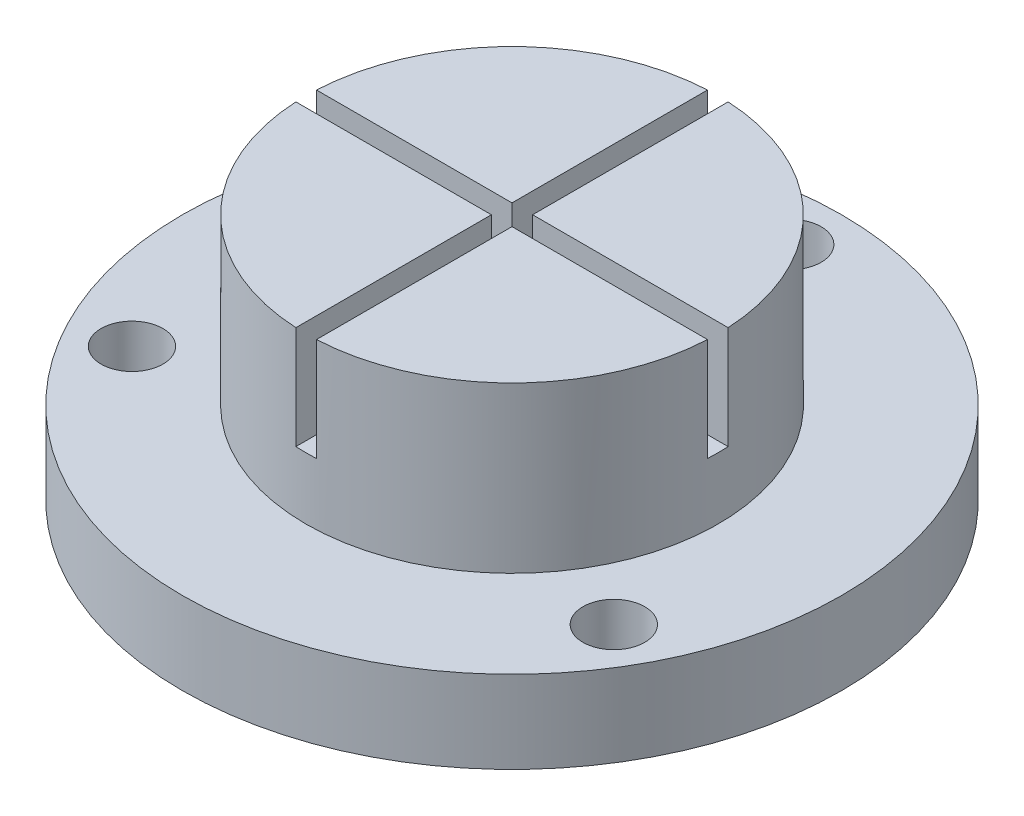
ISO-10303-21;
HEADER;
FILE_DESCRIPTION(('STEP AP214'),'2;1');
FILE_NAME('part.step','',(''),(''),'','','');
FILE_SCHEMA(('AUTOMOTIVE_DESIGN { 1 0 10303 214 1 1 1 1 }'));
ENDSEC;
DATA;
#1=APPLICATION_CONTEXT('core data for automotive mechanical design processes');
#2=APPLICATION_PROTOCOL_DEFINITION('international standard','automotive_design',2000,#1);
#3=PRODUCT_CONTEXT('',#1,'mechanical');
#4=PRODUCT('Part','Part','',(#3));
#5=PRODUCT_RELATED_PRODUCT_CATEGORY('part','',(#4));
#6=PRODUCT_DEFINITION_FORMATION('','',#4);
#7=PRODUCT_DEFINITION_CONTEXT('part definition',#1,'design');
#8=PRODUCT_DEFINITION('design','',#6,#7);
#9=PRODUCT_DEFINITION_SHAPE('','',#8);
#10=(LENGTH_UNIT() NAMED_UNIT(*) SI_UNIT(.MILLI.,.METRE.));
#11=(NAMED_UNIT(*) PLANE_ANGLE_UNIT() SI_UNIT($,.RADIAN.));
#12=(NAMED_UNIT(*) SI_UNIT($,.STERADIAN.) SOLID_ANGLE_UNIT());
#13=UNCERTAINTY_MEASURE_WITH_UNIT(LENGTH_MEASURE(1.E-05),#10,'distance_accuracy_value','');
#14=(GEOMETRIC_REPRESENTATION_CONTEXT(3) GLOBAL_UNCERTAINTY_ASSIGNED_CONTEXT((#13)) GLOBAL_UNIT_ASSIGNED_CONTEXT((#10,
#11,#12)) REPRESENTATION_CONTEXT('',''));
#15=CARTESIAN_POINT('',(0.,0.,0.));
#16=DIRECTION('',(0.,0.,1.));
#17=DIRECTION('',(1.,0.,0.));
#18=AXIS2_PLACEMENT_3D('',#15,#16,#17);
#19=CARTESIAN_POINT('',(0.,12.,0.));
#20=DIRECTION('',(0.,1.,0.));
#21=DIRECTION('',(0.,0.,1.));
#22=AXIS2_PLACEMENT_3D('',#19,#20,#21);
#23=CYLINDRICAL_SURFACE('',#22,10.);
#24=CARTESIAN_POINT('',(0.,7.,0.));
#25=DIRECTION('',(0.,-1.,0.));
#26=DIRECTION('',(0.,0.,-1.));
#27=AXIS2_PLACEMENT_3D('',#24,#25,#26);
#28=CIRCLE('',#27,10.);
#29=CARTESIAN_POINT('',(9.98749217771909,7.,-0.5));
#30=VERTEX_POINT('',#29);
#31=CARTESIAN_POINT('',(9.98749217771909,7.,0.5));
#32=VERTEX_POINT('',#31);
#33=EDGE_CURVE('E12',#30,#32,#28,.T.);
#34=ORIENTED_EDGE('',*,*,#33,.T.);
#35=DIRECTION('',(0.,1.,0.));
#36=VECTOR('',#35,1.);
#37=CARTESIAN_POINT('',(9.98749217771909,12.,0.5));
#38=LINE('',#37,#36);
#39=CARTESIAN_POINT('',(9.98749217771909,12.,0.5));
#40=VERTEX_POINT('',#39);
#41=EDGE_CURVE('E170',#32,#40,#38,.T.);
#42=ORIENTED_EDGE('',*,*,#41,.T.);
#43=CARTESIAN_POINT('',(0.,12.,0.));
#44=DIRECTION('',(0.,1.,0.));
#45=DIRECTION('',(0.,0.,1.));
#46=AXIS2_PLACEMENT_3D('',#43,#44,#45);
#47=CIRCLE('',#46,10.);
#48=CARTESIAN_POINT('',(0.5,12.,9.98749217771909));
#49=VERTEX_POINT('',#48);
#50=EDGE_CURVE('E230',#49,#40,#47,.T.);
#51=ORIENTED_EDGE('',*,*,#50,.F.);
#52=DIRECTION('',(0.,1.,0.));
#53=VECTOR('',#52,1.);
#54=CARTESIAN_POINT('',(0.5,12.,9.98749217771909));
#55=LINE('',#54,#53);
#56=CARTESIAN_POINT('',(0.5,7.,9.98749217771909));
#57=VERTEX_POINT('',#56);
#58=EDGE_CURVE('E77',#57,#49,#55,.T.);
#59=ORIENTED_EDGE('',*,*,#58,.F.);
#60=CARTESIAN_POINT('',(-0.5,7.,9.98749217771909));
#61=VERTEX_POINT('',#60);
#62=EDGE_CURVE('E65',#57,#61,#28,.T.);
#63=ORIENTED_EDGE('',*,*,#62,.T.);
#64=DIRECTION('',(0.,1.,0.));
#65=VECTOR('',#64,1.);
#66=CARTESIAN_POINT('',(-0.5,12.,9.98749217771909));
#67=LINE('',#66,#65);
#68=CARTESIAN_POINT('',(-0.5,12.,9.98749217771909));
#69=VERTEX_POINT('',#68);
#70=EDGE_CURVE('E182',#61,#69,#67,.T.);
#71=ORIENTED_EDGE('',*,*,#70,.T.);
#72=CARTESIAN_POINT('',(-9.98749217771909,12.,0.5));
#73=VERTEX_POINT('',#72);
#74=EDGE_CURVE('E226',#73,#69,#47,.T.);
#75=ORIENTED_EDGE('',*,*,#74,.F.);
#76=DIRECTION('',(0.,1.,0.));
#77=VECTOR('',#76,1.);
#78=CARTESIAN_POINT('',(-9.98749217771909,12.,0.5));
#79=LINE('',#78,#77);
#80=CARTESIAN_POINT('',(-9.98749217771909,7.,0.5));
#81=VERTEX_POINT('',#80);
#82=EDGE_CURVE('E193',#73,#81,#79,.F.);
#83=ORIENTED_EDGE('',*,*,#82,.T.);
#84=CARTESIAN_POINT('',(-9.98749217771909,7.,-0.5));
#85=VERTEX_POINT('',#84);
#86=EDGE_CURVE('E70',#81,#85,#28,.T.);
#87=ORIENTED_EDGE('',*,*,#86,.T.);
#88=DIRECTION('',(0.,1.,0.));
#89=VECTOR('',#88,1.);
#90=CARTESIAN_POINT('',(-9.98749217771909,12.,-0.5));
#91=LINE('',#90,#89);
#92=CARTESIAN_POINT('',(-9.98749217771909,12.,-0.5));
#93=VERTEX_POINT('',#92);
#94=EDGE_CURVE('E191',#93,#85,#91,.F.);
#95=ORIENTED_EDGE('',*,*,#94,.F.);
#96=CARTESIAN_POINT('',(-0.5,12.,-9.98749217771909));
#97=VERTEX_POINT('',#96);
#98=EDGE_CURVE('E229',#97,#93,#47,.T.);
#99=ORIENTED_EDGE('',*,*,#98,.F.);
#100=DIRECTION('',(0.,1.,0.));
#101=VECTOR('',#100,1.);
#102=CARTESIAN_POINT('',(-0.5,12.,-9.98749217771909));
#103=LINE('',#102,#101);
#104=CARTESIAN_POINT('',(-0.5,7.,-9.98749217771909));
#105=VERTEX_POINT('',#104);
#106=EDGE_CURVE('E185',#97,#105,#103,.F.);
#107=ORIENTED_EDGE('',*,*,#106,.T.);
#108=CARTESIAN_POINT('',(0.5,7.,-9.98749217771909));
#109=VERTEX_POINT('',#108);
#110=EDGE_CURVE('E250',#105,#109,#28,.T.);
#111=ORIENTED_EDGE('',*,*,#110,.T.);
#112=DIRECTION('',(0.,1.,0.));
#113=VECTOR('',#112,1.);
#114=CARTESIAN_POINT('',(0.5,12.,-9.98749217771909));
#115=LINE('',#114,#113);
#116=CARTESIAN_POINT('',(0.5,12.,-9.98749217771909));
#117=VERTEX_POINT('',#116);
#118=EDGE_CURVE('E188',#117,#109,#115,.F.);
#119=ORIENTED_EDGE('',*,*,#118,.F.);
#120=CARTESIAN_POINT('',(9.98749217771909,12.,-0.5));
#121=VERTEX_POINT('',#120);
#122=EDGE_CURVE('E281',#121,#117,#47,.T.);
#123=ORIENTED_EDGE('',*,*,#122,.F.);
#124=DIRECTION('',(0.,1.,0.));
#125=VECTOR('',#124,1.);
#126=CARTESIAN_POINT('',(9.98749217771909,12.,-0.5));
#127=LINE('',#126,#125);
#128=EDGE_CURVE('E196',#30,#121,#127,.T.);
#129=ORIENTED_EDGE('',*,*,#128,.F.);
#130=EDGE_LOOP('',(#34,#42,#51,#59,#63,#71,#75,#83,#87,#95,#99,#107,#111,#119,#123,#129));
#131=FACE_BOUND('',#130,.T.);
#132=CARTESIAN_POINT('',(0.,4.,0.));
#133=DIRECTION('',(0.,1.,0.));
#134=DIRECTION('',(0.,0.,1.));
#135=AXIS2_PLACEMENT_3D('',#132,#133,#134);
#136=CIRCLE('',#135,10.);
#137=CARTESIAN_POINT('',(0.,4.,10.));
#138=VERTEX_POINT('',#137);
#139=EDGE_CURVE('E223',#138,#138,#136,.T.);
#140=ORIENTED_EDGE('',*,*,#139,.T.);
#141=EDGE_LOOP('',(#140));
#142=FACE_BOUND('',#141,.T.);
#143=ADVANCED_FACE('F61',(#131,#142),#23,.T.);
#144=CARTESIAN_POINT('',(-10.,12.,0.));
#145=DIRECTION('',(0.,-1.,0.));
#146=DIRECTION('',(0.,0.,-1.));
#147=AXIS2_PLACEMENT_3D('',#144,#145,#146);
#148=PLANE('',#147);
#149=DIRECTION('',(-1.,0.,0.));
#150=VECTOR('',#149,1.);
#151=CARTESIAN_POINT('',(-10.,12.,-0.5));
#152=LINE('',#151,#150);
#153=CARTESIAN_POINT('',(0.5,12.,-0.5));
#154=VERTEX_POINT('',#153);
#155=EDGE_CURVE('E245',#121,#154,#152,.T.);
#156=ORIENTED_EDGE('',*,*,#155,.F.);
#157=ORIENTED_EDGE('',*,*,#122,.T.);
#158=DIRECTION('',(0.,0.,-1.));
#159=VECTOR('',#158,1.);
#160=CARTESIAN_POINT('',(0.5,12.,0.));
#161=LINE('',#160,#159);
#162=EDGE_CURVE('E244',#154,#117,#161,.T.);
#163=ORIENTED_EDGE('',*,*,#162,.F.);
#164=EDGE_LOOP('',(#156,#157,#163));
#165=FACE_BOUND('',#164,.T.);
#166=ADVANCED_FACE('F295',(#165),#148,.F.);
#167=DIRECTION('',(-1.,0.,0.));
#168=VECTOR('',#167,1.);
#169=CARTESIAN_POINT('',(-10.,12.,-0.5));
#170=LINE('',#169,#168);
#171=CARTESIAN_POINT('',(-0.5,12.,-0.5));
#172=VERTEX_POINT('',#171);
#173=EDGE_CURVE('E242',#172,#93,#170,.T.);
#174=ORIENTED_EDGE('',*,*,#173,.F.);
#175=DIRECTION('',(0.,0.,-1.));
#176=VECTOR('',#175,1.);
#177=CARTESIAN_POINT('',(-0.5,12.,0.));
#178=LINE('',#177,#176);
#179=EDGE_CURVE('E239',#172,#97,#178,.T.);
#180=ORIENTED_EDGE('',*,*,#179,.T.);
#181=ORIENTED_EDGE('',*,*,#98,.T.);
#182=EDGE_LOOP('',(#174,#180,#181));
#183=FACE_BOUND('',#182,.T.);
#184=ADVANCED_FACE('F280',(#183),#148,.F.);
#185=DIRECTION('',(0.,0.,-1.));
#186=VECTOR('',#185,1.);
#187=CARTESIAN_POINT('',(-0.5,12.,0.));
#188=LINE('',#187,#186);
#189=CARTESIAN_POINT('',(-0.5,12.,0.5));
#190=VERTEX_POINT('',#189);
#191=EDGE_CURVE('E233',#69,#190,#188,.T.);
#192=ORIENTED_EDGE('',*,*,#191,.T.);
#193=DIRECTION('',(-1.,0.,0.));
#194=VECTOR('',#193,1.);
#195=CARTESIAN_POINT('',(-10.,12.,0.5));
#196=LINE('',#195,#194);
#197=EDGE_CURVE('E236',#190,#73,#196,.T.);
#198=ORIENTED_EDGE('',*,*,#197,.T.);
#199=ORIENTED_EDGE('',*,*,#74,.T.);
#200=EDGE_LOOP('',(#192,#198,#199));
#201=FACE_BOUND('',#200,.T.);
#202=ADVANCED_FACE('F301',(#201),#148,.F.);
#203=CARTESIAN_POINT('',(0.,0.,0.));
#204=DIRECTION('',(0.,1.,0.));
#205=DIRECTION('',(0.,0.,1.));
#206=AXIS2_PLACEMENT_3D('',#203,#204,#205);
#207=PLANE('',#206);
#208=CARTESIAN_POINT('',(11.6913429510899,0.,6.75));
#209=DIRECTION('',(0.,-1.,0.));
#210=DIRECTION('',(0.,0.,-1.));
#211=AXIS2_PLACEMENT_3D('',#208,#209,#210);
#212=CIRCLE('',#211,1.5);
#213=CARTESIAN_POINT('',(11.6913429510899,0.,5.25));
#214=VERTEX_POINT('',#213);
#215=EDGE_CURVE('E199',#214,#214,#212,.T.);
#216=ORIENTED_EDGE('',*,*,#215,.F.);
#217=EDGE_LOOP('',(#216));
#218=FACE_BOUND('',#217,.T.);
#219=CARTESIAN_POINT('',(-11.6913429510899,0.,6.75));
#220=DIRECTION('',(0.,-1.,0.));
#221=DIRECTION('',(0.,0.,-1.));
#222=AXIS2_PLACEMENT_3D('',#219,#220,#221);
#223=CIRCLE('',#222,1.5);
#224=CARTESIAN_POINT('',(-11.6913429510899,0.,5.25));
#225=VERTEX_POINT('',#224);
#226=EDGE_CURVE('E202',#225,#225,#223,.T.);
#227=ORIENTED_EDGE('',*,*,#226,.F.);
#228=EDGE_LOOP('',(#227));
#229=FACE_BOUND('',#228,.T.);
#230=CARTESIAN_POINT('',(0.,0.,-13.5));
#231=DIRECTION('',(0.,-1.,0.));
#232=DIRECTION('',(0.,0.,-1.));
#233=AXIS2_PLACEMENT_3D('',#230,#231,#232);
#234=CIRCLE('',#233,1.5);
#235=CARTESIAN_POINT('',(0.,0.,-15.));
#236=VERTEX_POINT('',#235);
#237=EDGE_CURVE('E205',#236,#236,#234,.T.);
#238=ORIENTED_EDGE('',*,*,#237,.F.);
#239=EDGE_LOOP('',(#238));
#240=FACE_BOUND('',#239,.T.);
#241=CARTESIAN_POINT('',(0.,0.,0.));
#242=DIRECTION('',(0.,1.,0.));
#243=DIRECTION('',(0.,0.,1.));
#244=AXIS2_PLACEMENT_3D('',#241,#242,#243);
#245=CIRCLE('',#244,16.);
#246=CARTESIAN_POINT('',(0.,0.,16.));
#247=VERTEX_POINT('',#246);
#248=EDGE_CURVE('E208',#247,#247,#245,.T.);
#249=ORIENTED_EDGE('',*,*,#248,.F.);
#250=EDGE_LOOP('',(#249));
#251=FACE_BOUND('',#250,.T.);
#252=ADVANCED_FACE('F313',(#218,#229,#240,#251),#207,.F.);
#253=CARTESIAN_POINT('',(11.6913429510899,0.,6.75));
#254=DIRECTION('',(0.,-1.,0.));
#255=DIRECTION('',(0.,0.,-1.));
#256=AXIS2_PLACEMENT_3D('',#253,#254,#255);
#257=CYLINDRICAL_SURFACE('',#256,1.5);
#258=ORIENTED_EDGE('',*,*,#215,.T.);
#259=EDGE_LOOP('',(#258));
#260=FACE_BOUND('',#259,.T.);
#261=CARTESIAN_POINT('',(11.6913429510899,4.,6.75));
#262=DIRECTION('',(0.,-1.,0.));
#263=DIRECTION('',(0.,0.,-1.));
#264=AXIS2_PLACEMENT_3D('',#261,#262,#263);
#265=CIRCLE('',#264,1.5);
#266=CARTESIAN_POINT('',(11.6913429510899,4.,5.25));
#267=VERTEX_POINT('',#266);
#268=EDGE_CURVE('E211',#267,#267,#265,.T.);
#269=ORIENTED_EDGE('',*,*,#268,.F.);
#270=EDGE_LOOP('',(#269));
#271=FACE_BOUND('',#270,.T.);
#272=ADVANCED_FACE('F318',(#260,#271),#257,.F.);
#273=CARTESIAN_POINT('',(-11.6913429510899,0.,6.75));
#274=DIRECTION('',(0.,-1.,0.));
#275=DIRECTION('',(0.,0.,-1.));
#276=AXIS2_PLACEMENT_3D('',#273,#274,#275);
#277=CYLINDRICAL_SURFACE('',#276,1.5);
#278=ORIENTED_EDGE('',*,*,#226,.T.);
#279=EDGE_LOOP('',(#278));
#280=FACE_BOUND('',#279,.T.);
#281=CARTESIAN_POINT('',(-11.6913429510899,4.,6.75));
#282=DIRECTION('',(0.,-1.,0.));
#283=DIRECTION('',(0.,0.,-1.));
#284=AXIS2_PLACEMENT_3D('',#281,#282,#283);
#285=CIRCLE('',#284,1.5);
#286=CARTESIAN_POINT('',(-11.6913429510899,4.,5.25));
#287=VERTEX_POINT('',#286);
#288=EDGE_CURVE('E214',#287,#287,#285,.T.);
#289=ORIENTED_EDGE('',*,*,#288,.F.);
#290=EDGE_LOOP('',(#289));
#291=FACE_BOUND('',#290,.T.);
#292=ADVANCED_FACE('F324',(#280,#291),#277,.F.);
#293=CARTESIAN_POINT('',(0.,0.,-13.5));
#294=DIRECTION('',(0.,-1.,0.));
#295=DIRECTION('',(0.,0.,-1.));
#296=AXIS2_PLACEMENT_3D('',#293,#294,#295);
#297=CYLINDRICAL_SURFACE('',#296,1.5);
#298=ORIENTED_EDGE('',*,*,#237,.T.);
#299=EDGE_LOOP('',(#298));
#300=FACE_BOUND('',#299,.T.);
#301=CARTESIAN_POINT('',(0.,4.,-13.5));
#302=DIRECTION('',(0.,-1.,0.));
#303=DIRECTION('',(0.,0.,-1.));
#304=AXIS2_PLACEMENT_3D('',#301,#302,#303);
#305=CIRCLE('',#304,1.5);
#306=CARTESIAN_POINT('',(0.,4.,-15.));
#307=VERTEX_POINT('',#306);
#308=EDGE_CURVE('E217',#307,#307,#305,.T.);
#309=ORIENTED_EDGE('',*,*,#308,.F.);
#310=EDGE_LOOP('',(#309));
#311=FACE_BOUND('',#310,.T.);
#312=ADVANCED_FACE('F334',(#300,#311),#297,.F.);
#313=CARTESIAN_POINT('',(0.,12.,0.));
#314=DIRECTION('',(0.,1.,0.));
#315=DIRECTION('',(0.,0.,1.));
#316=AXIS2_PLACEMENT_3D('',#313,#314,#315);
#317=CYLINDRICAL_SURFACE('',#316,16.);
#318=CARTESIAN_POINT('',(0.,4.,0.));
#319=DIRECTION('',(0.,1.,0.));
#320=DIRECTION('',(0.,0.,1.));
#321=AXIS2_PLACEMENT_3D('',#318,#319,#320);
#322=CIRCLE('',#321,16.);
#323=CARTESIAN_POINT('',(0.,4.,16.));
#324=VERTEX_POINT('',#323);
#325=EDGE_CURVE('E220',#324,#324,#322,.T.);
#326=ORIENTED_EDGE('',*,*,#325,.F.);
#327=EDGE_LOOP('',(#326));
#328=FACE_BOUND('',#327,.T.);
#329=ORIENTED_EDGE('',*,*,#248,.T.);
#330=EDGE_LOOP('',(#329));
#331=FACE_BOUND('',#330,.T.);
#332=ADVANCED_FACE('F309',(#328,#331),#317,.T.);
#333=CARTESIAN_POINT('',(-16.,4.,0.));
#334=DIRECTION('',(0.,-1.,0.));
#335=DIRECTION('',(0.,0.,-1.));
#336=AXIS2_PLACEMENT_3D('',#333,#334,#335);
#337=PLANE('',#336);
#338=ORIENTED_EDGE('',*,*,#268,.T.);
#339=EDGE_LOOP('',(#338));
#340=FACE_BOUND('',#339,.T.);
#341=ORIENTED_EDGE('',*,*,#288,.T.);
#342=EDGE_LOOP('',(#341));
#343=FACE_BOUND('',#342,.T.);
#344=ORIENTED_EDGE('',*,*,#308,.T.);
#345=EDGE_LOOP('',(#344));
#346=FACE_BOUND('',#345,.T.);
#347=ORIENTED_EDGE('',*,*,#139,.F.);
#348=EDGE_LOOP('',(#347));
#349=FACE_BOUND('',#348,.T.);
#350=ORIENTED_EDGE('',*,*,#325,.T.);
#351=EDGE_LOOP('',(#350));
#352=FACE_BOUND('',#351,.T.);
#353=ADVANCED_FACE('F303',(#340,#343,#346,#349,#352),#337,.F.);
#354=ORIENTED_EDGE('',*,*,#50,.T.);
#355=DIRECTION('',(-1.,0.,0.));
#356=VECTOR('',#355,1.);
#357=CARTESIAN_POINT('',(-10.,12.,0.5));
#358=LINE('',#357,#356);
#359=CARTESIAN_POINT('',(0.5,12.,0.5));
#360=VERTEX_POINT('',#359);
#361=EDGE_CURVE('E85',#40,#360,#358,.T.);
#362=ORIENTED_EDGE('',*,*,#361,.T.);
#363=DIRECTION('',(0.,0.,-1.));
#364=VECTOR('',#363,1.);
#365=CARTESIAN_POINT('',(0.5,12.,0.));
#366=LINE('',#365,#364);
#367=EDGE_CURVE('E154',#49,#360,#366,.T.);
#368=ORIENTED_EDGE('',*,*,#367,.F.);
#369=EDGE_LOOP('',(#354,#362,#368));
#370=FACE_BOUND('',#369,.T.);
#371=ADVANCED_FACE('F63',(#370),#148,.F.);
#372=CARTESIAN_POINT('',(0.,7.,0.));
#373=DIRECTION('',(0.,-1.,0.));
#374=DIRECTION('',(-1.,0.,0.));
#375=AXIS2_PLACEMENT_3D('',#372,#373,#374);
#376=PLANE('',#375);
#377=DIRECTION('',(1.,0.,0.));
#378=VECTOR('',#377,1.);
#379=CARTESIAN_POINT('',(-10.,7.,-0.5));
#380=LINE('',#379,#378);
#381=CARTESIAN_POINT('',(0.5,7.,-0.5));
#382=VERTEX_POINT('',#381);
#383=EDGE_CURVE('E174',#382,#30,#380,.T.);
#384=ORIENTED_EDGE('',*,*,#383,.F.);
#385=DIRECTION('',(0.,0.,-1.));
#386=VECTOR('',#385,1.);
#387=CARTESIAN_POINT('',(0.5,7.,-10.));
#388=LINE('',#387,#386);
#389=EDGE_CURVE('E166',#109,#382,#388,.F.);
#390=ORIENTED_EDGE('',*,*,#389,.F.);
#391=ORIENTED_EDGE('',*,*,#110,.F.);
#392=DIRECTION('',(0.,0.,-1.));
#393=VECTOR('',#392,1.);
#394=CARTESIAN_POINT('',(-0.5,7.,-10.));
#395=LINE('',#394,#393);
#396=CARTESIAN_POINT('',(-0.5,7.,-0.5));
#397=VERTEX_POINT('',#396);
#398=EDGE_CURVE('E167',#105,#397,#395,.F.);
#399=ORIENTED_EDGE('',*,*,#398,.T.);
#400=EDGE_CURVE('E179',#85,#397,#380,.T.);
#401=ORIENTED_EDGE('',*,*,#400,.F.);
#402=ORIENTED_EDGE('',*,*,#86,.F.);
#403=DIRECTION('',(1.,0.,0.));
#404=VECTOR('',#403,1.);
#405=CARTESIAN_POINT('',(-10.,7.,0.5));
#406=LINE('',#405,#404);
#407=CARTESIAN_POINT('',(-0.5,7.,0.5));
#408=VERTEX_POINT('',#407);
#409=EDGE_CURVE('E171',#81,#408,#406,.T.);
#410=ORIENTED_EDGE('',*,*,#409,.T.);
#411=EDGE_CURVE('E267',#408,#61,#395,.F.);
#412=ORIENTED_EDGE('',*,*,#411,.T.);
#413=ORIENTED_EDGE('',*,*,#62,.F.);
#414=CARTESIAN_POINT('',(0.5,7.,0.5));
#415=VERTEX_POINT('',#414);
#416=EDGE_CURVE('E153',#415,#57,#388,.F.);
#417=ORIENTED_EDGE('',*,*,#416,.F.);
#418=EDGE_CURVE('E163',#415,#32,#406,.T.);
#419=ORIENTED_EDGE('',*,*,#418,.T.);
#420=ORIENTED_EDGE('',*,*,#33,.F.);
#421=EDGE_LOOP('',(#384,#390,#391,#399,#401,#402,#410,#412,#413,#417,#419,#420));
#422=FACE_BOUND('',#421,.T.);
#423=ADVANCED_FACE('F162',(#422),#376,.F.);
#424=CARTESIAN_POINT('',(-10.,7.,0.5));
#425=DIRECTION('',(0.,0.,1.));
#426=DIRECTION('',(1.,0.,0.));
#427=AXIS2_PLACEMENT_3D('',#424,#425,#426);
#428=PLANE('',#427);
#429=ORIENTED_EDGE('',*,*,#418,.F.);
#430=DIRECTION('',(0.,-1.,0.));
#431=VECTOR('',#430,1.);
#432=CARTESIAN_POINT('',(0.5,7.,0.5));
#433=LINE('',#432,#431);
#434=EDGE_CURVE('E150',#360,#415,#433,.T.);
#435=ORIENTED_EDGE('',*,*,#434,.F.);
#436=ORIENTED_EDGE('',*,*,#361,.F.);
#437=ORIENTED_EDGE('',*,*,#41,.F.);
#438=EDGE_LOOP('',(#429,#435,#436,#437));
#439=FACE_BOUND('',#438,.T.);
#440=ADVANCED_FACE('F169',(#439),#428,.F.);
#441=CARTESIAN_POINT('',(-10.,7.,-0.5));
#442=DIRECTION('',(0.,0.,1.));
#443=DIRECTION('',(1.,0.,0.));
#444=AXIS2_PLACEMENT_3D('',#441,#442,#443);
#445=PLANE('',#444);
#446=ORIENTED_EDGE('',*,*,#128,.T.);
#447=ORIENTED_EDGE('',*,*,#155,.T.);
#448=DIRECTION('',(0.,-1.,0.));
#449=VECTOR('',#448,1.);
#450=CARTESIAN_POINT('',(0.5,7.,-0.5));
#451=LINE('',#450,#449);
#452=EDGE_CURVE('E157',#154,#382,#451,.T.);
#453=ORIENTED_EDGE('',*,*,#452,.T.);
#454=ORIENTED_EDGE('',*,*,#383,.T.);
#455=EDGE_LOOP('',(#446,#447,#453,#454));
#456=FACE_BOUND('',#455,.T.);
#457=ADVANCED_FACE('F292',(#456),#445,.T.);
#458=ORIENTED_EDGE('',*,*,#197,.F.);
#459=DIRECTION('',(0.,-1.,0.));
#460=VECTOR('',#459,1.);
#461=CARTESIAN_POINT('',(-0.5,7.,0.5));
#462=LINE('',#461,#460);
#463=EDGE_CURVE('E172',#190,#408,#462,.T.);
#464=ORIENTED_EDGE('',*,*,#463,.T.);
#465=ORIENTED_EDGE('',*,*,#409,.F.);
#466=ORIENTED_EDGE('',*,*,#82,.F.);
#467=EDGE_LOOP('',(#458,#464,#465,#466));
#468=FACE_BOUND('',#467,.T.);
#469=ADVANCED_FACE('F263',(#468),#428,.F.);
#470=ORIENTED_EDGE('',*,*,#94,.T.);
#471=ORIENTED_EDGE('',*,*,#400,.T.);
#472=DIRECTION('',(0.,-1.,0.));
#473=VECTOR('',#472,1.);
#474=CARTESIAN_POINT('',(-0.5,7.,-0.5));
#475=LINE('',#474,#473);
#476=EDGE_CURVE('E156',#172,#397,#475,.T.);
#477=ORIENTED_EDGE('',*,*,#476,.F.);
#478=ORIENTED_EDGE('',*,*,#173,.T.);
#479=EDGE_LOOP('',(#470,#471,#477,#478));
#480=FACE_BOUND('',#479,.T.);
#481=ADVANCED_FACE('F278',(#480),#445,.T.);
#482=CARTESIAN_POINT('',(0.5,7.,-10.));
#483=DIRECTION('',(-1.,0.,0.));
#484=DIRECTION('',(0.,0.,1.));
#485=AXIS2_PLACEMENT_3D('',#482,#483,#484);
#486=PLANE('',#485);
#487=ORIENTED_EDGE('',*,*,#118,.T.);
#488=ORIENTED_EDGE('',*,*,#389,.T.);
#489=ORIENTED_EDGE('',*,*,#452,.F.);
#490=ORIENTED_EDGE('',*,*,#162,.T.);
#491=EDGE_LOOP('',(#487,#488,#489,#490));
#492=FACE_BOUND('',#491,.T.);
#493=ADVANCED_FACE('F294',(#492),#486,.T.);
#494=CARTESIAN_POINT('',(-0.5,7.,-10.));
#495=DIRECTION('',(-1.,0.,0.));
#496=DIRECTION('',(0.,0.,1.));
#497=AXIS2_PLACEMENT_3D('',#494,#495,#496);
#498=PLANE('',#497);
#499=ORIENTED_EDGE('',*,*,#179,.F.);
#500=ORIENTED_EDGE('',*,*,#476,.T.);
#501=ORIENTED_EDGE('',*,*,#398,.F.);
#502=ORIENTED_EDGE('',*,*,#106,.F.);
#503=EDGE_LOOP('',(#499,#500,#501,#502));
#504=FACE_BOUND('',#503,.T.);
#505=ADVANCED_FACE('F275',(#504),#498,.F.);
#506=ORIENTED_EDGE('',*,*,#411,.F.);
#507=ORIENTED_EDGE('',*,*,#463,.F.);
#508=ORIENTED_EDGE('',*,*,#191,.F.);
#509=ORIENTED_EDGE('',*,*,#70,.F.);
#510=EDGE_LOOP('',(#506,#507,#508,#509));
#511=FACE_BOUND('',#510,.T.);
#512=ADVANCED_FACE('F268',(#511),#498,.F.);
#513=ORIENTED_EDGE('',*,*,#58,.T.);
#514=ORIENTED_EDGE('',*,*,#367,.T.);
#515=ORIENTED_EDGE('',*,*,#434,.T.);
#516=ORIENTED_EDGE('',*,*,#416,.T.);
#517=EDGE_LOOP('',(#513,#514,#515,#516));
#518=FACE_BOUND('',#517,.T.);
#519=ADVANCED_FACE('F152',(#518),#486,.T.);
#520=CLOSED_SHELL('',(#143,#166,#184,#202,#252,#272,#292,#312,#332,#353,#371,#423,#440,#457,
#469,#481,#493,#505,#512,#519));
#521=MANIFOLD_SOLID_BREP('B2',#520);
#522=ADVANCED_BREP_SHAPE_REPRESENTATION('',(#18,#521),#14);
#523=SHAPE_DEFINITION_REPRESENTATION(#9,#522);
ENDSEC;
END-ISO-10303-21;
